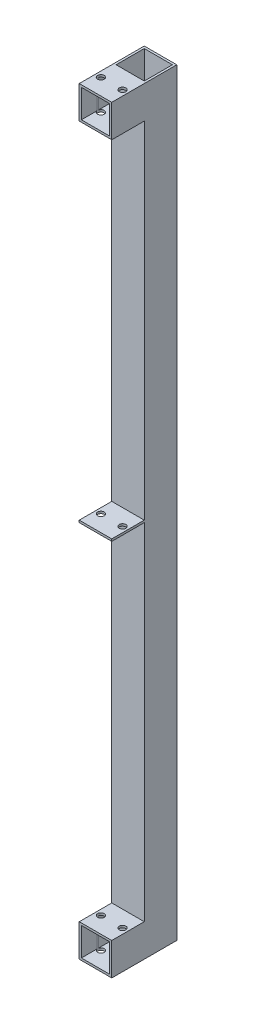
ISO-10303-21;
HEADER;
FILE_DESCRIPTION(('STEP AP214'),'2;1');
FILE_NAME('part.step','',(''),(''),'','','');
FILE_SCHEMA(('AUTOMOTIVE_DESIGN { 1 0 10303 214 1 1 1 1 }'));
ENDSEC;
DATA;
#1=APPLICATION_CONTEXT('core data for automotive mechanical design processes');
#2=APPLICATION_PROTOCOL_DEFINITION('international standard','automotive_design',2000,#1);
#3=PRODUCT_CONTEXT('',#1,'mechanical');
#4=PRODUCT('Part','Part','',(#3));
#5=PRODUCT_RELATED_PRODUCT_CATEGORY('part','',(#4));
#6=PRODUCT_DEFINITION_FORMATION('','',#4);
#7=PRODUCT_DEFINITION_CONTEXT('part definition',#1,'design');
#8=PRODUCT_DEFINITION('design','',#6,#7);
#9=PRODUCT_DEFINITION_SHAPE('','',#8);
#10=(LENGTH_UNIT() NAMED_UNIT(*) SI_UNIT(.MILLI.,.METRE.));
#11=(NAMED_UNIT(*) PLANE_ANGLE_UNIT() SI_UNIT($,.RADIAN.));
#12=(NAMED_UNIT(*) SI_UNIT($,.STERADIAN.) SOLID_ANGLE_UNIT());
#13=UNCERTAINTY_MEASURE_WITH_UNIT(LENGTH_MEASURE(1.E-05),#10,'distance_accuracy_value','');
#14=(GEOMETRIC_REPRESENTATION_CONTEXT(3) GLOBAL_UNCERTAINTY_ASSIGNED_CONTEXT((#13)) GLOBAL_UNIT_ASSIGNED_CONTEXT((#10,
#11,#12)) REPRESENTATION_CONTEXT('',''));
#15=CARTESIAN_POINT('',(0.,0.,0.));
#16=DIRECTION('',(0.,0.,1.));
#17=DIRECTION('',(1.,0.,0.));
#18=AXIS2_PLACEMENT_3D('',#15,#16,#17);
#19=CARTESIAN_POINT('',(13.,348.,30.));
#20=DIRECTION('',(1.,0.,0.));
#21=DIRECTION('',(0.,1.,0.));
#22=AXIS2_PLACEMENT_3D('',#19,#20,#21);
#23=PLANE('',#22);
#24=DIRECTION('',(0.,0.,1.));
#25=VECTOR('',#24,1.);
#26=CARTESIAN_POINT('',(13.,348.,30.));
#27=LINE('',#26,#25);
#28=CARTESIAN_POINT('',(13.,348.,45.55));
#29=VERTEX_POINT('',#28);
#30=CARTESIAN_POINT('',(13.,348.,60.));
#31=VERTEX_POINT('',#30);
#32=EDGE_CURVE('E303',#29,#31,#27,.T.);
#33=ORIENTED_EDGE('',*,*,#32,.F.);
#34=DIRECTION('',(0.,-1.,0.));
#35=VECTOR('',#34,1.);
#36=CARTESIAN_POINT('',(13.,350.,45.55));
#37=LINE('',#36,#35);
#38=CARTESIAN_POINT('',(13.,322.,45.55));
#39=VERTEX_POINT('',#38);
#40=EDGE_CURVE('E540',#29,#39,#37,.T.);
#41=ORIENTED_EDGE('',*,*,#40,.T.);
#42=DIRECTION('',(0.,0.,1.));
#43=VECTOR('',#42,1.);
#44=CARTESIAN_POINT('',(13.,322.,30.));
#45=LINE('',#44,#43);
#46=CARTESIAN_POINT('',(13.,322.,60.));
#47=VERTEX_POINT('',#46);
#48=EDGE_CURVE('E307',#39,#47,#45,.T.);
#49=ORIENTED_EDGE('',*,*,#48,.T.);
#50=DIRECTION('',(0.,1.,0.));
#51=VECTOR('',#50,1.);
#52=CARTESIAN_POINT('',(13.,348.,60.));
#53=LINE('',#52,#51);
#54=EDGE_CURVE('E290',#47,#31,#53,.T.);
#55=ORIENTED_EDGE('',*,*,#54,.T.);
#56=EDGE_LOOP('',(#33,#41,#49,#55));
#57=FACE_BOUND('',#56,.T.);
#58=ADVANCED_FACE('F32',(#57),#23,.F.);
#59=CARTESIAN_POINT('',(13.,-322.,30.));
#60=DIRECTION('',(1.,0.,0.));
#61=DIRECTION('',(0.,1.,0.));
#62=AXIS2_PLACEMENT_3D('',#59,#60,#61);
#63=PLANE('',#62);
#64=DIRECTION('',(0.,0.,1.));
#65=VECTOR('',#64,1.);
#66=CARTESIAN_POINT('',(13.,-322.,30.));
#67=LINE('',#66,#65);
#68=CARTESIAN_POINT('',(12.9999999999999,-322.,45.5500000000005));
#69=VERTEX_POINT('',#68);
#70=CARTESIAN_POINT('',(13.,-322.,60.));
#71=VERTEX_POINT('',#70);
#72=EDGE_CURVE('E252',#69,#71,#67,.T.);
#73=ORIENTED_EDGE('',*,*,#72,.F.);
#74=DIRECTION('',(0.,-1.,0.));
#75=VECTOR('',#74,1.);
#76=CARTESIAN_POINT('',(12.9999999999999,350.,45.5500000000005));
#77=LINE('',#76,#75);
#78=CARTESIAN_POINT('',(13.,-348.,45.55));
#79=VERTEX_POINT('',#78);
#80=EDGE_CURVE('E241',#69,#79,#77,.T.);
#81=ORIENTED_EDGE('',*,*,#80,.T.);
#82=DIRECTION('',(0.,0.,1.));
#83=VECTOR('',#82,1.);
#84=CARTESIAN_POINT('',(13.,-348.,30.));
#85=LINE('',#84,#83);
#86=CARTESIAN_POINT('',(13.,-348.,60.));
#87=VERTEX_POINT('',#86);
#88=EDGE_CURVE('E250',#79,#87,#85,.T.);
#89=ORIENTED_EDGE('',*,*,#88,.T.);
#90=DIRECTION('',(0.,1.,0.));
#91=VECTOR('',#90,1.);
#92=CARTESIAN_POINT('',(13.,-322.,60.));
#93=LINE('',#92,#91);
#94=EDGE_CURVE('E431',#87,#71,#93,.T.);
#95=ORIENTED_EDGE('',*,*,#94,.T.);
#96=EDGE_LOOP('',(#73,#81,#89,#95));
#97=FACE_BOUND('',#96,.T.);
#98=ADVANCED_FACE('F248',(#97),#63,.F.);
#99=CARTESIAN_POINT('',(-13.,348.,30.));
#100=DIRECTION('',(-1.,0.,0.));
#101=DIRECTION('',(0.,-1.,0.));
#102=AXIS2_PLACEMENT_3D('',#99,#100,#101);
#103=PLANE('',#102);
#104=DIRECTION('',(0.,0.,1.));
#105=VECTOR('',#104,1.);
#106=CARTESIAN_POINT('',(-13.,348.,30.));
#107=LINE('',#106,#105);
#108=CARTESIAN_POINT('',(-13.,348.,30.));
#109=VERTEX_POINT('',#108);
#110=CARTESIAN_POINT('',(-13.,348.,44.45));
#111=VERTEX_POINT('',#110);
#112=EDGE_CURVE('E295',#109,#111,#107,.T.);
#113=ORIENTED_EDGE('',*,*,#112,.T.);
#114=DIRECTION('',(0.,-1.,0.));
#115=VECTOR('',#114,1.);
#116=CARTESIAN_POINT('',(-13.,350.,44.45));
#117=LINE('',#116,#115);
#118=CARTESIAN_POINT('',(-13.,322.,44.45));
#119=VERTEX_POINT('',#118);
#120=EDGE_CURVE('E578',#111,#119,#117,.T.);
#121=ORIENTED_EDGE('',*,*,#120,.T.);
#122=DIRECTION('',(0.,0.,1.));
#123=VECTOR('',#122,1.);
#124=CARTESIAN_POINT('',(-13.,322.,30.));
#125=LINE('',#124,#123);
#126=CARTESIAN_POINT('',(-13.,322.,30.));
#127=VERTEX_POINT('',#126);
#128=EDGE_CURVE('E308',#127,#119,#125,.T.);
#129=ORIENTED_EDGE('',*,*,#128,.F.);
#130=DIRECTION('',(0.,-1.,0.));
#131=VECTOR('',#130,1.);
#132=CARTESIAN_POINT('',(-13.,348.,30.));
#133=LINE('',#132,#131);
#134=EDGE_CURVE('E269',#109,#127,#133,.T.);
#135=ORIENTED_EDGE('',*,*,#134,.F.);
#136=EDGE_LOOP('',(#113,#121,#129,#135));
#137=FACE_BOUND('',#136,.T.);
#138=ADVANCED_FACE('F506',(#137),#103,.F.);
#139=CARTESIAN_POINT('',(-13.,-322.,30.));
#140=DIRECTION('',(-1.,0.,0.));
#141=DIRECTION('',(0.,-1.,0.));
#142=AXIS2_PLACEMENT_3D('',#139,#140,#141);
#143=PLANE('',#142);
#144=DIRECTION('',(0.,0.,1.));
#145=VECTOR('',#144,1.);
#146=CARTESIAN_POINT('',(-13.,-322.,30.));
#147=LINE('',#146,#145);
#148=CARTESIAN_POINT('',(-13.,-322.,30.));
#149=VERTEX_POINT('',#148);
#150=CARTESIAN_POINT('',(-13.0000000000001,-322.,44.4500000000005));
#151=VERTEX_POINT('',#150);
#152=EDGE_CURVE('E287',#149,#151,#147,.T.);
#153=ORIENTED_EDGE('',*,*,#152,.T.);
#154=DIRECTION('',(0.,-1.,0.));
#155=VECTOR('',#154,1.);
#156=CARTESIAN_POINT('',(-13.0000000000001,350.,44.4500000000005));
#157=LINE('',#156,#155);
#158=CARTESIAN_POINT('',(-13.,-348.,44.45));
#159=VERTEX_POINT('',#158);
#160=EDGE_CURVE('E567',#151,#159,#157,.T.);
#161=ORIENTED_EDGE('',*,*,#160,.T.);
#162=DIRECTION('',(0.,0.,1.));
#163=VECTOR('',#162,1.);
#164=CARTESIAN_POINT('',(-13.,-348.,30.));
#165=LINE('',#164,#163);
#166=CARTESIAN_POINT('',(-13.,-348.,30.));
#167=VERTEX_POINT('',#166);
#168=EDGE_CURVE('E260',#167,#159,#165,.T.);
#169=ORIENTED_EDGE('',*,*,#168,.F.);
#170=DIRECTION('',(0.,-1.,0.));
#171=VECTOR('',#170,1.);
#172=CARTESIAN_POINT('',(-13.,-322.,30.));
#173=LINE('',#172,#171);
#174=EDGE_CURVE('E435',#149,#167,#173,.T.);
#175=ORIENTED_EDGE('',*,*,#174,.F.);
#176=EDGE_LOOP('',(#153,#161,#169,#175));
#177=FACE_BOUND('',#176,.T.);
#178=ADVANCED_FACE('F500',(#177),#143,.F.);
#179=CARTESIAN_POINT('',(0.,0.,30.));
#180=DIRECTION('',(0.,0.,1.));
#181=DIRECTION('',(1.,0.,0.));
#182=AXIS2_PLACEMENT_3D('',#179,#180,#181);
#183=PLANE('',#182);
#184=DIRECTION('',(0.,1.,0.));
#185=VECTOR('',#184,1.);
#186=CARTESIAN_POINT('',(15.,-350.,30.));
#187=LINE('',#186,#185);
#188=CARTESIAN_POINT('',(15.,-320.,30.));
#189=VERTEX_POINT('',#188);
#190=CARTESIAN_POINT('',(15.,-1.,30.));
#191=VERTEX_POINT('',#190);
#192=EDGE_CURVE('E381',#189,#191,#187,.T.);
#193=ORIENTED_EDGE('',*,*,#192,.T.);
#194=DIRECTION('',(1.,0.,0.));
#195=VECTOR('',#194,1.);
#196=CARTESIAN_POINT('',(15.,-0.999999999999999,30.));
#197=LINE('',#196,#195);
#198=CARTESIAN_POINT('',(-15.,-1.,30.));
#199=VERTEX_POINT('',#198);
#200=EDGE_CURVE('E298',#199,#191,#197,.T.);
#201=ORIENTED_EDGE('',*,*,#200,.F.);
#202=DIRECTION('',(0.,-1.,0.));
#203=VECTOR('',#202,1.);
#204=CARTESIAN_POINT('',(-15.,-350.,30.));
#205=LINE('',#204,#203);
#206=CARTESIAN_POINT('',(-15.,-320.,30.));
#207=VERTEX_POINT('',#206);
#208=EDGE_CURVE('E380',#199,#207,#205,.T.);
#209=ORIENTED_EDGE('',*,*,#208,.T.);
#210=DIRECTION('',(-1.,0.,0.));
#211=VECTOR('',#210,1.);
#212=CARTESIAN_POINT('',(-15.,-320.,30.));
#213=LINE('',#212,#211);
#214=EDGE_CURVE('E337',#189,#207,#213,.T.);
#215=ORIENTED_EDGE('',*,*,#214,.F.);
#216=EDGE_LOOP('',(#193,#201,#209,#215));
#217=FACE_BOUND('',#216,.T.);
#218=ADVANCED_FACE('F498',(#217),#183,.T.);
#219=CARTESIAN_POINT('',(-15.,320.,30.));
#220=VERTEX_POINT('',#219);
#221=CARTESIAN_POINT('',(-15.,1.,30.));
#222=VERTEX_POINT('',#221);
#223=EDGE_CURVE('E377',#220,#222,#205,.T.);
#224=ORIENTED_EDGE('',*,*,#223,.T.);
#225=DIRECTION('',(-1.,0.,0.));
#226=VECTOR('',#225,1.);
#227=CARTESIAN_POINT('',(15.,1.,30.));
#228=LINE('',#227,#226);
#229=CARTESIAN_POINT('',(15.,1.,30.));
#230=VERTEX_POINT('',#229);
#231=EDGE_CURVE('E315',#230,#222,#228,.T.);
#232=ORIENTED_EDGE('',*,*,#231,.F.);
#233=CARTESIAN_POINT('',(15.,320.,30.));
#234=VERTEX_POINT('',#233);
#235=EDGE_CURVE('E379',#230,#234,#187,.T.);
#236=ORIENTED_EDGE('',*,*,#235,.T.);
#237=DIRECTION('',(1.,0.,0.));
#238=VECTOR('',#237,1.);
#239=CARTESIAN_POINT('',(-15.,320.,30.));
#240=LINE('',#239,#238);
#241=EDGE_CURVE('E356',#220,#234,#240,.T.);
#242=ORIENTED_EDGE('',*,*,#241,.F.);
#243=EDGE_LOOP('',(#224,#232,#236,#242));
#244=FACE_BOUND('',#243,.T.);
#245=ADVANCED_FACE('F487',(#244),#183,.T.);
#246=CARTESIAN_POINT('',(-15.,-350.,30.));
#247=DIRECTION('',(1.,0.,0.));
#248=DIRECTION('',(0.,0.,-1.));
#249=AXIS2_PLACEMENT_3D('',#246,#247,#248);
#250=PLANE('',#249);
#251=DIRECTION('',(0.,-1.,0.));
#252=VECTOR('',#251,1.);
#253=CARTESIAN_POINT('',(-15.,-350.,0.));
#254=LINE('',#253,#252);
#255=CARTESIAN_POINT('',(-15.,350.,0.));
#256=VERTEX_POINT('',#255);
#257=CARTESIAN_POINT('',(-15.,-350.,0.));
#258=VERTEX_POINT('',#257);
#259=EDGE_CURVE('E376',#256,#258,#254,.T.);
#260=ORIENTED_EDGE('',*,*,#259,.T.);
#261=DIRECTION('',(0.,0.,-1.));
#262=VECTOR('',#261,1.);
#263=CARTESIAN_POINT('',(-15.,-350.,30.));
#264=LINE('',#263,#262);
#265=CARTESIAN_POINT('',(-15.,-350.,60.));
#266=VERTEX_POINT('',#265);
#267=EDGE_CURVE('E400',#266,#258,#264,.T.);
#268=ORIENTED_EDGE('',*,*,#267,.F.);
#269=DIRECTION('',(0.,-1.,0.));
#270=VECTOR('',#269,1.);
#271=CARTESIAN_POINT('',(-15.,-350.,60.));
#272=LINE('',#271,#270);
#273=CARTESIAN_POINT('',(-15.,-320.,60.));
#274=VERTEX_POINT('',#273);
#275=EDGE_CURVE('E345',#274,#266,#272,.T.);
#276=ORIENTED_EDGE('',*,*,#275,.F.);
#277=DIRECTION('',(0.,0.,-1.));
#278=VECTOR('',#277,1.);
#279=CARTESIAN_POINT('',(-15.,-320.,60.));
#280=LINE('',#279,#278);
#281=EDGE_CURVE('E348',#274,#207,#280,.T.);
#282=ORIENTED_EDGE('',*,*,#281,.T.);
#283=ORIENTED_EDGE('',*,*,#208,.F.);
#284=DIRECTION('',(0.,0.,-1.));
#285=VECTOR('',#284,1.);
#286=CARTESIAN_POINT('',(-15.,-0.999999999999999,60.));
#287=LINE('',#286,#285);
#288=CARTESIAN_POINT('',(-15.,-0.999999999999999,60.));
#289=VERTEX_POINT('',#288);
#290=EDGE_CURVE('E334',#289,#199,#287,.T.);
#291=ORIENTED_EDGE('',*,*,#290,.F.);
#292=DIRECTION('',(0.,-1.,0.));
#293=VECTOR('',#292,1.);
#294=CARTESIAN_POINT('',(-15.,1.,60.));
#295=LINE('',#294,#293);
#296=CARTESIAN_POINT('',(-15.,1.,60.));
#297=VERTEX_POINT('',#296);
#298=EDGE_CURVE('E311',#297,#289,#295,.T.);
#299=ORIENTED_EDGE('',*,*,#298,.F.);
#300=DIRECTION('',(0.,0.,-1.));
#301=VECTOR('',#300,1.);
#302=CARTESIAN_POINT('',(-15.,1.,60.));
#303=LINE('',#302,#301);
#304=EDGE_CURVE('E321',#297,#222,#303,.T.);
#305=ORIENTED_EDGE('',*,*,#304,.T.);
#306=ORIENTED_EDGE('',*,*,#223,.F.);
#307=DIRECTION('',(0.,0.,-1.));
#308=VECTOR('',#307,1.);
#309=CARTESIAN_POINT('',(-15.,320.,60.));
#310=LINE('',#309,#308);
#311=CARTESIAN_POINT('',(-15.,320.,60.));
#312=VERTEX_POINT('',#311);
#313=EDGE_CURVE('E373',#312,#220,#310,.T.);
#314=ORIENTED_EDGE('',*,*,#313,.F.);
#315=DIRECTION('',(0.,-1.,0.));
#316=VECTOR('',#315,1.);
#317=CARTESIAN_POINT('',(-15.,350.,60.));
#318=LINE('',#317,#316);
#319=CARTESIAN_POINT('',(-15.,350.,60.));
#320=VERTEX_POINT('',#319);
#321=EDGE_CURVE('E357',#320,#312,#318,.T.);
#322=ORIENTED_EDGE('',*,*,#321,.F.);
#323=DIRECTION('',(0.,0.,-1.));
#324=VECTOR('',#323,1.);
#325=CARTESIAN_POINT('',(-15.,350.,30.));
#326=LINE('',#325,#324);
#327=EDGE_CURVE('E383',#320,#256,#326,.T.);
#328=ORIENTED_EDGE('',*,*,#327,.T.);
#329=EDGE_LOOP('',(#260,#268,#276,#282,#283,#291,#299,#305,#306,#314,#322,#328));
#330=FACE_BOUND('',#329,.T.);
#331=ADVANCED_FACE('F34',(#330),#250,.F.);
#332=CARTESIAN_POINT('',(15.,-350.,30.));
#333=DIRECTION('',(0.,1.,0.));
#334=DIRECTION('',(0.,0.,1.));
#335=AXIS2_PLACEMENT_3D('',#332,#333,#334);
#336=PLANE('',#335);
#337=CARTESIAN_POINT('',(10.,-350.,45.));
#338=DIRECTION('',(0.,-1.,0.));
#339=DIRECTION('',(0.,0.,-1.));
#340=AXIS2_PLACEMENT_3D('',#337,#338,#339);
#341=CIRCLE('',#340,3.05);
#342=CARTESIAN_POINT('',(10.,-350.,41.95));
#343=VERTEX_POINT('',#342);
#344=EDGE_CURVE('E634',#343,#343,#341,.T.);
#345=ORIENTED_EDGE('',*,*,#344,.F.);
#346=EDGE_LOOP('',(#345));
#347=FACE_BOUND('',#346,.T.);
#348=CARTESIAN_POINT('',(-10.,-350.,45.));
#349=DIRECTION('',(0.,-1.,0.));
#350=DIRECTION('',(0.,0.,-1.));
#351=AXIS2_PLACEMENT_3D('',#348,#349,#350);
#352=CIRCLE('',#351,3.05);
#353=CARTESIAN_POINT('',(-10.,-350.,41.95));
#354=VERTEX_POINT('',#353);
#355=EDGE_CURVE('E560',#354,#354,#352,.T.);
#356=ORIENTED_EDGE('',*,*,#355,.F.);
#357=EDGE_LOOP('',(#356));
#358=FACE_BOUND('',#357,.T.);
#359=DIRECTION('',(1.,0.,0.));
#360=VECTOR('',#359,1.);
#361=CARTESIAN_POINT('',(13.,-350.,2.));
#362=LINE('',#361,#360);
#363=CARTESIAN_POINT('',(-13.,-350.,1.99999999999999));
#364=VERTEX_POINT('',#363);
#365=CARTESIAN_POINT('',(13.,-350.,2.));
#366=VERTEX_POINT('',#365);
#367=EDGE_CURVE('E612',#364,#366,#362,.T.);
#368=ORIENTED_EDGE('',*,*,#367,.F.);
#369=DIRECTION('',(0.,0.,-1.));
#370=VECTOR('',#369,1.);
#371=CARTESIAN_POINT('',(-13.,-350.,28.));
#372=LINE('',#371,#370);
#373=CARTESIAN_POINT('',(-13.,-350.,28.));
#374=VERTEX_POINT('',#373);
#375=EDGE_CURVE('E596',#374,#364,#372,.T.);
#376=ORIENTED_EDGE('',*,*,#375,.F.);
#377=DIRECTION('',(-1.,0.,0.));
#378=VECTOR('',#377,1.);
#379=CARTESIAN_POINT('',(13.,-350.,28.));
#380=LINE('',#379,#378);
#381=CARTESIAN_POINT('',(13.,-350.,28.));
#382=VERTEX_POINT('',#381);
#383=EDGE_CURVE('E601',#382,#374,#380,.T.);
#384=ORIENTED_EDGE('',*,*,#383,.F.);
#385=DIRECTION('',(0.,0.,1.));
#386=VECTOR('',#385,1.);
#387=CARTESIAN_POINT('',(13.,-350.,28.));
#388=LINE('',#387,#386);
#389=EDGE_CURVE('E615',#366,#382,#388,.T.);
#390=ORIENTED_EDGE('',*,*,#389,.F.);
#391=EDGE_LOOP('',(#368,#376,#384,#390));
#392=FACE_BOUND('',#391,.T.);
#393=DIRECTION('',(1.,0.,0.));
#394=VECTOR('',#393,1.);
#395=CARTESIAN_POINT('',(15.,-350.,0.));
#396=LINE('',#395,#394);
#397=CARTESIAN_POINT('',(15.,-350.,0.));
#398=VERTEX_POINT('',#397);
#399=EDGE_CURVE('E386',#258,#398,#396,.T.);
#400=ORIENTED_EDGE('',*,*,#399,.T.);
#401=DIRECTION('',(0.,0.,-1.));
#402=VECTOR('',#401,1.);
#403=CARTESIAN_POINT('',(15.,-350.,30.));
#404=LINE('',#403,#402);
#405=CARTESIAN_POINT('',(15.,-350.,60.));
#406=VERTEX_POINT('',#405);
#407=EDGE_CURVE('E397',#406,#398,#404,.T.);
#408=ORIENTED_EDGE('',*,*,#407,.F.);
#409=DIRECTION('',(1.,0.,0.));
#410=VECTOR('',#409,1.);
#411=CARTESIAN_POINT('',(-15.,-350.,60.));
#412=LINE('',#411,#410);
#413=EDGE_CURVE('E338',#266,#406,#412,.T.);
#414=ORIENTED_EDGE('',*,*,#413,.F.);
#415=ORIENTED_EDGE('',*,*,#267,.T.);
#416=EDGE_LOOP('',(#400,#408,#414,#415));
#417=FACE_BOUND('',#416,.T.);
#418=ADVANCED_FACE('F456',(#347,#358,#392,#417),#336,.F.);
#419=CARTESIAN_POINT('',(15.,-350.,30.));
#420=DIRECTION('',(-1.,0.,0.));
#421=DIRECTION('',(0.,0.,1.));
#422=AXIS2_PLACEMENT_3D('',#419,#420,#421);
#423=PLANE('',#422);
#424=DIRECTION('',(0.,1.,0.));
#425=VECTOR('',#424,1.);
#426=CARTESIAN_POINT('',(15.,-350.,0.));
#427=LINE('',#426,#425);
#428=CARTESIAN_POINT('',(15.,350.,0.));
#429=VERTEX_POINT('',#428);
#430=EDGE_CURVE('E388',#398,#429,#427,.T.);
#431=ORIENTED_EDGE('',*,*,#430,.T.);
#432=DIRECTION('',(0.,0.,-1.));
#433=VECTOR('',#432,1.);
#434=CARTESIAN_POINT('',(15.,350.,30.));
#435=LINE('',#434,#433);
#436=CARTESIAN_POINT('',(15.,350.,60.));
#437=VERTEX_POINT('',#436);
#438=EDGE_CURVE('E394',#437,#429,#435,.T.);
#439=ORIENTED_EDGE('',*,*,#438,.F.);
#440=DIRECTION('',(0.,1.,0.));
#441=VECTOR('',#440,1.);
#442=CARTESIAN_POINT('',(15.,350.,60.));
#443=LINE('',#442,#441);
#444=CARTESIAN_POINT('',(15.,320.,60.));
#445=VERTEX_POINT('',#444);
#446=EDGE_CURVE('E362',#445,#437,#443,.T.);
#447=ORIENTED_EDGE('',*,*,#446,.F.);
#448=DIRECTION('',(0.,0.,-1.));
#449=VECTOR('',#448,1.);
#450=CARTESIAN_POINT('',(15.,320.,60.));
#451=LINE('',#450,#449);
#452=EDGE_CURVE('E368',#445,#234,#451,.T.);
#453=ORIENTED_EDGE('',*,*,#452,.T.);
#454=ORIENTED_EDGE('',*,*,#235,.F.);
#455=DIRECTION('',(0.,0.,-1.));
#456=VECTOR('',#455,1.);
#457=CARTESIAN_POINT('',(15.,1.,60.));
#458=LINE('',#457,#456);
#459=CARTESIAN_POINT('',(15.,1.,60.));
#460=VERTEX_POINT('',#459);
#461=EDGE_CURVE('E328',#460,#230,#458,.T.);
#462=ORIENTED_EDGE('',*,*,#461,.F.);
#463=DIRECTION('',(0.,1.,0.));
#464=VECTOR('',#463,1.);
#465=CARTESIAN_POINT('',(15.,1.,60.));
#466=LINE('',#465,#464);
#467=CARTESIAN_POINT('',(15.,-0.999999999999999,60.));
#468=VERTEX_POINT('',#467);
#469=EDGE_CURVE('E317',#468,#460,#466,.T.);
#470=ORIENTED_EDGE('',*,*,#469,.F.);
#471=DIRECTION('',(0.,0.,-1.));
#472=VECTOR('',#471,1.);
#473=CARTESIAN_POINT('',(15.,-0.999999999999999,60.));
#474=LINE('',#473,#472);
#475=EDGE_CURVE('E331',#468,#191,#474,.T.);
#476=ORIENTED_EDGE('',*,*,#475,.T.);
#477=ORIENTED_EDGE('',*,*,#192,.F.);
#478=DIRECTION('',(0.,0.,-1.));
#479=VECTOR('',#478,1.);
#480=CARTESIAN_POINT('',(15.,-320.,60.));
#481=LINE('',#480,#479);
#482=CARTESIAN_POINT('',(15.,-320.,60.));
#483=VERTEX_POINT('',#482);
#484=EDGE_CURVE('E353',#483,#189,#481,.T.);
#485=ORIENTED_EDGE('',*,*,#484,.F.);
#486=DIRECTION('',(0.,1.,0.));
#487=VECTOR('',#486,1.);
#488=CARTESIAN_POINT('',(15.,-350.,60.));
#489=LINE('',#488,#487);
#490=EDGE_CURVE('E341',#406,#483,#489,.T.);
#491=ORIENTED_EDGE('',*,*,#490,.F.);
#492=ORIENTED_EDGE('',*,*,#407,.T.);
#493=EDGE_LOOP('',(#431,#439,#447,#453,#454,#462,#470,#476,#477,#485,#491,#492));
#494=FACE_BOUND('',#493,.T.);
#495=ADVANCED_FACE('F459',(#494),#423,.F.);
#496=CARTESIAN_POINT('',(15.,350.,30.));
#497=DIRECTION('',(0.,-1.,0.));
#498=DIRECTION('',(0.,0.,-1.));
#499=AXIS2_PLACEMENT_3D('',#496,#497,#498);
#500=PLANE('',#499);
#501=CARTESIAN_POINT('',(10.,350.,45.));
#502=DIRECTION('',(0.,-1.,0.));
#503=DIRECTION('',(0.,0.,-1.));
#504=AXIS2_PLACEMENT_3D('',#501,#502,#503);
#505=CIRCLE('',#504,3.05);
#506=CARTESIAN_POINT('',(10.,350.,41.95));
#507=VERTEX_POINT('',#506);
#508=EDGE_CURVE('E631',#507,#507,#505,.T.);
#509=ORIENTED_EDGE('',*,*,#508,.T.);
#510=EDGE_LOOP('',(#509));
#511=FACE_BOUND('',#510,.T.);
#512=CARTESIAN_POINT('',(-10.,350.,45.));
#513=DIRECTION('',(0.,-1.,0.));
#514=DIRECTION('',(0.,0.,-1.));
#515=AXIS2_PLACEMENT_3D('',#512,#513,#514);
#516=CIRCLE('',#515,3.05);
#517=CARTESIAN_POINT('',(-10.,350.,41.95));
#518=VERTEX_POINT('',#517);
#519=EDGE_CURVE('E561',#518,#518,#516,.T.);
#520=ORIENTED_EDGE('',*,*,#519,.T.);
#521=EDGE_LOOP('',(#520));
#522=FACE_BOUND('',#521,.T.);
#523=DIRECTION('',(-1.,0.,0.));
#524=VECTOR('',#523,1.);
#525=CARTESIAN_POINT('',(13.,350.,28.));
#526=LINE('',#525,#524);
#527=CARTESIAN_POINT('',(13.,350.,28.));
#528=VERTEX_POINT('',#527);
#529=CARTESIAN_POINT('',(-13.,350.,28.));
#530=VERTEX_POINT('',#529);
#531=EDGE_CURVE('E607',#528,#530,#526,.T.);
#532=ORIENTED_EDGE('',*,*,#531,.T.);
#533=DIRECTION('',(0.,0.,-1.));
#534=VECTOR('',#533,1.);
#535=CARTESIAN_POINT('',(-13.,350.,28.));
#536=LINE('',#535,#534);
#537=CARTESIAN_POINT('',(-13.,350.,1.99999999999999));
#538=VERTEX_POINT('',#537);
#539=EDGE_CURVE('E597',#530,#538,#536,.T.);
#540=ORIENTED_EDGE('',*,*,#539,.T.);
#541=DIRECTION('',(1.,0.,0.));
#542=VECTOR('',#541,1.);
#543=CARTESIAN_POINT('',(13.,350.,2.));
#544=LINE('',#543,#542);
#545=CARTESIAN_POINT('',(13.,350.,2.));
#546=VERTEX_POINT('',#545);
#547=EDGE_CURVE('E600',#538,#546,#544,.T.);
#548=ORIENTED_EDGE('',*,*,#547,.T.);
#549=DIRECTION('',(0.,0.,1.));
#550=VECTOR('',#549,1.);
#551=CARTESIAN_POINT('',(13.,350.,28.));
#552=LINE('',#551,#550);
#553=EDGE_CURVE('E604',#546,#528,#552,.T.);
#554=ORIENTED_EDGE('',*,*,#553,.T.);
#555=EDGE_LOOP('',(#532,#540,#548,#554));
#556=FACE_BOUND('',#555,.T.);
#557=DIRECTION('',(-1.,0.,0.));
#558=VECTOR('',#557,1.);
#559=CARTESIAN_POINT('',(15.,350.,0.));
#560=LINE('',#559,#558);
#561=EDGE_CURVE('E390',#429,#256,#560,.T.);
#562=ORIENTED_EDGE('',*,*,#561,.T.);
#563=ORIENTED_EDGE('',*,*,#327,.F.);
#564=DIRECTION('',(-1.,0.,0.));
#565=VECTOR('',#564,1.);
#566=CARTESIAN_POINT('',(-15.,350.,60.));
#567=LINE('',#566,#565);
#568=EDGE_CURVE('E365',#437,#320,#567,.T.);
#569=ORIENTED_EDGE('',*,*,#568,.F.);
#570=ORIENTED_EDGE('',*,*,#438,.T.);
#571=EDGE_LOOP('',(#562,#563,#569,#570));
#572=FACE_BOUND('',#571,.T.);
#573=ADVANCED_FACE('F474',(#511,#522,#556,#572),#500,.F.);
#574=CARTESIAN_POINT('',(0.,0.,0.));
#575=DIRECTION('',(0.,0.,1.));
#576=DIRECTION('',(1.,0.,0.));
#577=AXIS2_PLACEMENT_3D('',#574,#575,#576);
#578=PLANE('',#577);
#579=CARTESIAN_POINT('',(0.,0.,0.));
#580=DIRECTION('',(0.,0.,-1.));
#581=DIRECTION('',(-1.,0.,0.));
#582=AXIS2_PLACEMENT_3D('',#579,#580,#581);
#583=CIRCLE('',#582,7.05);
#584=CARTESIAN_POINT('',(-7.05,0.,0.));
#585=VERTEX_POINT('',#584);
#586=EDGE_CURVE('E639',#585,#585,#583,.T.);
#587=ORIENTED_EDGE('',*,*,#586,.F.);
#588=EDGE_LOOP('',(#587));
#589=FACE_BOUND('',#588,.T.);
#590=ORIENTED_EDGE('',*,*,#259,.F.);
#591=ORIENTED_EDGE('',*,*,#561,.F.);
#592=ORIENTED_EDGE('',*,*,#430,.F.);
#593=ORIENTED_EDGE('',*,*,#399,.F.);
#594=EDGE_LOOP('',(#590,#591,#592,#593));
#595=FACE_BOUND('',#594,.T.);
#596=ADVANCED_FACE('F470',(#589,#595),#578,.F.);
#597=CARTESIAN_POINT('',(-15.,320.,60.));
#598=DIRECTION('',(0.,1.,0.));
#599=DIRECTION('',(0.,0.,1.));
#600=AXIS2_PLACEMENT_3D('',#597,#598,#599);
#601=PLANE('',#600);
#602=CARTESIAN_POINT('',(10.,320.,45.));
#603=DIRECTION('',(0.,1.,0.));
#604=DIRECTION('',(0.,0.,1.));
#605=AXIS2_PLACEMENT_3D('',#602,#603,#604);
#606=CIRCLE('',#605,3.05);
#607=CARTESIAN_POINT('',(10.,320.,48.05));
#608=VERTEX_POINT('',#607);
#609=EDGE_CURVE('E557',#608,#608,#606,.T.);
#610=ORIENTED_EDGE('',*,*,#609,.T.);
#611=EDGE_LOOP('',(#610));
#612=FACE_BOUND('',#611,.T.);
#613=CARTESIAN_POINT('',(-10.,320.,45.));
#614=DIRECTION('',(0.,1.,0.));
#615=DIRECTION('',(0.,0.,1.));
#616=AXIS2_PLACEMENT_3D('',#613,#614,#615);
#617=CIRCLE('',#616,3.05);
#618=CARTESIAN_POINT('',(-10.,320.,48.05));
#619=VERTEX_POINT('',#618);
#620=EDGE_CURVE('E593',#619,#619,#617,.T.);
#621=ORIENTED_EDGE('',*,*,#620,.T.);
#622=EDGE_LOOP('',(#621));
#623=FACE_BOUND('',#622,.T.);
#624=ORIENTED_EDGE('',*,*,#241,.T.);
#625=ORIENTED_EDGE('',*,*,#452,.F.);
#626=DIRECTION('',(1.,0.,0.));
#627=VECTOR('',#626,1.);
#628=CARTESIAN_POINT('',(-15.,320.,60.));
#629=LINE('',#628,#627);
#630=EDGE_CURVE('E360',#312,#445,#629,.T.);
#631=ORIENTED_EDGE('',*,*,#630,.F.);
#632=ORIENTED_EDGE('',*,*,#313,.T.);
#633=EDGE_LOOP('',(#624,#625,#631,#632));
#634=FACE_BOUND('',#633,.T.);
#635=ADVANCED_FACE('F480',(#612,#623,#634),#601,.F.);
#636=CARTESIAN_POINT('',(0.,0.,60.));
#637=DIRECTION('',(0.,0.,1.));
#638=DIRECTION('',(1.,0.,0.));
#639=AXIS2_PLACEMENT_3D('',#636,#637,#638);
#640=PLANE('',#639);
#641=DIRECTION('',(0.,-1.,0.));
#642=VECTOR('',#641,1.);
#643=CARTESIAN_POINT('',(-13.,348.,60.));
#644=LINE('',#643,#642);
#645=CARTESIAN_POINT('',(-13.,348.,60.));
#646=VERTEX_POINT('',#645);
#647=CARTESIAN_POINT('',(-13.,322.,60.));
#648=VERTEX_POINT('',#647);
#649=EDGE_CURVE('E283',#646,#648,#644,.T.);
#650=ORIENTED_EDGE('',*,*,#649,.F.);
#651=DIRECTION('',(-1.,0.,0.));
#652=VECTOR('',#651,1.);
#653=CARTESIAN_POINT('',(13.,348.,60.));
#654=LINE('',#653,#652);
#655=EDGE_CURVE('E273',#31,#646,#654,.T.);
#656=ORIENTED_EDGE('',*,*,#655,.F.);
#657=ORIENTED_EDGE('',*,*,#54,.F.);
#658=DIRECTION('',(1.,0.,0.));
#659=VECTOR('',#658,1.);
#660=CARTESIAN_POINT('',(13.,322.,60.));
#661=LINE('',#660,#659);
#662=EDGE_CURVE('E286',#648,#47,#661,.T.);
#663=ORIENTED_EDGE('',*,*,#662,.F.);
#664=EDGE_LOOP('',(#650,#656,#657,#663));
#665=FACE_BOUND('',#664,.T.);
#666=ORIENTED_EDGE('',*,*,#321,.T.);
#667=ORIENTED_EDGE('',*,*,#630,.T.);
#668=ORIENTED_EDGE('',*,*,#446,.T.);
#669=ORIENTED_EDGE('',*,*,#568,.T.);
#670=EDGE_LOOP('',(#666,#667,#668,#669));
#671=FACE_BOUND('',#670,.T.);
#672=ADVANCED_FACE('F476',(#665,#671),#640,.T.);
#673=CARTESIAN_POINT('',(-15.,-320.,60.));
#674=DIRECTION('',(0.,-1.,0.));
#675=DIRECTION('',(0.,0.,-1.));
#676=AXIS2_PLACEMENT_3D('',#673,#674,#675);
#677=PLANE('',#676);
#678=CARTESIAN_POINT('',(10.,-320.,45.));
#679=DIRECTION('',(0.,-1.,0.));
#680=DIRECTION('',(0.,0.,-1.));
#681=AXIS2_PLACEMENT_3D('',#678,#679,#680);
#682=CIRCLE('',#681,3.05);
#683=CARTESIAN_POINT('',(10.,-320.,41.95));
#684=VERTEX_POINT('',#683);
#685=EDGE_CURVE('E554',#684,#684,#682,.T.);
#686=ORIENTED_EDGE('',*,*,#685,.T.);
#687=EDGE_LOOP('',(#686));
#688=FACE_BOUND('',#687,.T.);
#689=CARTESIAN_POINT('',(-10.,-320.,45.));
#690=DIRECTION('',(0.,-1.,0.));
#691=DIRECTION('',(0.,0.,-1.));
#692=AXIS2_PLACEMENT_3D('',#689,#690,#691);
#693=CIRCLE('',#692,3.05);
#694=CARTESIAN_POINT('',(-10.,-320.,41.95));
#695=VERTEX_POINT('',#694);
#696=EDGE_CURVE('E590',#695,#695,#693,.T.);
#697=ORIENTED_EDGE('',*,*,#696,.T.);
#698=EDGE_LOOP('',(#697));
#699=FACE_BOUND('',#698,.T.);
#700=ORIENTED_EDGE('',*,*,#214,.T.);
#701=ORIENTED_EDGE('',*,*,#281,.F.);
#702=DIRECTION('',(-1.,0.,0.));
#703=VECTOR('',#702,1.);
#704=CARTESIAN_POINT('',(-15.,-320.,60.));
#705=LINE('',#704,#703);
#706=EDGE_CURVE('E343',#483,#274,#705,.T.);
#707=ORIENTED_EDGE('',*,*,#706,.F.);
#708=ORIENTED_EDGE('',*,*,#484,.T.);
#709=EDGE_LOOP('',(#700,#701,#707,#708));
#710=FACE_BOUND('',#709,.T.);
#711=ADVANCED_FACE('F449',(#688,#699,#710),#677,.F.);
#712=CARTESIAN_POINT('',(0.,0.,60.));
#713=DIRECTION('',(0.,0.,1.));
#714=DIRECTION('',(1.,0.,0.));
#715=AXIS2_PLACEMENT_3D('',#712,#713,#714);
#716=PLANE('',#715);
#717=DIRECTION('',(0.,-1.,0.));
#718=VECTOR('',#717,1.);
#719=CARTESIAN_POINT('',(-13.,-322.,60.));
#720=LINE('',#719,#718);
#721=CARTESIAN_POINT('',(-13.,-322.,60.));
#722=VERTEX_POINT('',#721);
#723=CARTESIAN_POINT('',(-13.,-348.,60.));
#724=VERTEX_POINT('',#723);
#725=EDGE_CURVE('E415',#722,#724,#720,.T.);
#726=ORIENTED_EDGE('',*,*,#725,.F.);
#727=DIRECTION('',(-1.,0.,0.));
#728=VECTOR('',#727,1.);
#729=CARTESIAN_POINT('',(13.,-322.,60.));
#730=LINE('',#729,#728);
#731=EDGE_CURVE('E433',#71,#722,#730,.T.);
#732=ORIENTED_EDGE('',*,*,#731,.F.);
#733=ORIENTED_EDGE('',*,*,#94,.F.);
#734=DIRECTION('',(1.,0.,0.));
#735=VECTOR('',#734,1.);
#736=CARTESIAN_POINT('',(13.,-348.,60.));
#737=LINE('',#736,#735);
#738=EDGE_CURVE('E257',#724,#87,#737,.T.);
#739=ORIENTED_EDGE('',*,*,#738,.F.);
#740=EDGE_LOOP('',(#726,#732,#733,#739));
#741=FACE_BOUND('',#740,.T.);
#742=ORIENTED_EDGE('',*,*,#413,.T.);
#743=ORIENTED_EDGE('',*,*,#490,.T.);
#744=ORIENTED_EDGE('',*,*,#706,.T.);
#745=ORIENTED_EDGE('',*,*,#275,.T.);
#746=EDGE_LOOP('',(#742,#743,#744,#745));
#747=FACE_BOUND('',#746,.T.);
#748=ADVANCED_FACE('F445',(#741,#747),#716,.T.);
#749=CARTESIAN_POINT('',(15.,-0.999999999999999,60.));
#750=DIRECTION('',(0.,1.,0.));
#751=DIRECTION('',(0.,0.,1.));
#752=AXIS2_PLACEMENT_3D('',#749,#750,#751);
#753=PLANE('',#752);
#754=CARTESIAN_POINT('',(10.,-1.,45.));
#755=DIRECTION('',(0.,1.,0.));
#756=DIRECTION('',(0.,0.,1.));
#757=AXIS2_PLACEMENT_3D('',#754,#755,#756);
#758=CIRCLE('',#757,3.05);
#759=CARTESIAN_POINT('',(10.,-1.,48.05));
#760=VERTEX_POINT('',#759);
#761=EDGE_CURVE('E551',#760,#760,#758,.T.);
#762=ORIENTED_EDGE('',*,*,#761,.T.);
#763=EDGE_LOOP('',(#762));
#764=FACE_BOUND('',#763,.T.);
#765=CARTESIAN_POINT('',(-10.,-1.,45.));
#766=DIRECTION('',(0.,1.,0.));
#767=DIRECTION('',(0.,0.,1.));
#768=AXIS2_PLACEMENT_3D('',#765,#766,#767);
#769=CIRCLE('',#768,3.05);
#770=CARTESIAN_POINT('',(-10.,-1.,48.05));
#771=VERTEX_POINT('',#770);
#772=EDGE_CURVE('E587',#771,#771,#769,.T.);
#773=ORIENTED_EDGE('',*,*,#772,.T.);
#774=EDGE_LOOP('',(#773));
#775=FACE_BOUND('',#774,.T.);
#776=ORIENTED_EDGE('',*,*,#200,.T.);
#777=ORIENTED_EDGE('',*,*,#475,.F.);
#778=DIRECTION('',(1.,0.,0.));
#779=VECTOR('',#778,1.);
#780=CARTESIAN_POINT('',(15.,-0.999999999999999,60.));
#781=LINE('',#780,#779);
#782=EDGE_CURVE('E314',#289,#468,#781,.T.);
#783=ORIENTED_EDGE('',*,*,#782,.F.);
#784=ORIENTED_EDGE('',*,*,#290,.T.);
#785=EDGE_LOOP('',(#776,#777,#783,#784));
#786=FACE_BOUND('',#785,.T.);
#787=ADVANCED_FACE('F448',(#764,#775,#786),#753,.F.);
#788=CARTESIAN_POINT('',(15.,1.,60.));
#789=DIRECTION('',(0.,-1.,0.));
#790=DIRECTION('',(0.,0.,-1.));
#791=AXIS2_PLACEMENT_3D('',#788,#789,#790);
#792=PLANE('',#791);
#793=CARTESIAN_POINT('',(10.,1.,45.));
#794=DIRECTION('',(0.,-1.,0.));
#795=DIRECTION('',(0.,0.,-1.));
#796=AXIS2_PLACEMENT_3D('',#793,#794,#795);
#797=CIRCLE('',#796,3.05);
#798=CARTESIAN_POINT('',(10.,1.,41.95));
#799=VERTEX_POINT('',#798);
#800=EDGE_CURVE('E548',#799,#799,#797,.T.);
#801=ORIENTED_EDGE('',*,*,#800,.T.);
#802=EDGE_LOOP('',(#801));
#803=FACE_BOUND('',#802,.T.);
#804=CARTESIAN_POINT('',(-10.,1.,45.));
#805=DIRECTION('',(0.,-1.,0.));
#806=DIRECTION('',(0.,0.,-1.));
#807=AXIS2_PLACEMENT_3D('',#804,#805,#806);
#808=CIRCLE('',#807,3.05);
#809=CARTESIAN_POINT('',(-10.,1.,41.95));
#810=VERTEX_POINT('',#809);
#811=EDGE_CURVE('E584',#810,#810,#808,.T.);
#812=ORIENTED_EDGE('',*,*,#811,.T.);
#813=EDGE_LOOP('',(#812));
#814=FACE_BOUND('',#813,.T.);
#815=ORIENTED_EDGE('',*,*,#231,.T.);
#816=ORIENTED_EDGE('',*,*,#304,.F.);
#817=DIRECTION('',(-1.,0.,0.));
#818=VECTOR('',#817,1.);
#819=CARTESIAN_POINT('',(15.,1.,60.));
#820=LINE('',#819,#818);
#821=EDGE_CURVE('E319',#460,#297,#820,.T.);
#822=ORIENTED_EDGE('',*,*,#821,.F.);
#823=ORIENTED_EDGE('',*,*,#461,.T.);
#824=EDGE_LOOP('',(#815,#816,#822,#823));
#825=FACE_BOUND('',#824,.T.);
#826=ADVANCED_FACE('F490',(#803,#814,#825),#792,.F.);
#827=CARTESIAN_POINT('',(0.,0.,60.));
#828=DIRECTION('',(0.,0.,-1.));
#829=DIRECTION('',(-1.,0.,0.));
#830=AXIS2_PLACEMENT_3D('',#827,#828,#829);
#831=PLANE('',#830);
#832=ORIENTED_EDGE('',*,*,#298,.T.);
#833=ORIENTED_EDGE('',*,*,#782,.T.);
#834=ORIENTED_EDGE('',*,*,#469,.T.);
#835=ORIENTED_EDGE('',*,*,#821,.T.);
#836=EDGE_LOOP('',(#832,#833,#834,#835));
#837=FACE_BOUND('',#836,.T.);
#838=ADVANCED_FACE('F493',(#837),#831,.F.);
#839=CARTESIAN_POINT('',(-13.,322.,45.55));
#840=VERTEX_POINT('',#839);
#841=EDGE_CURVE('E282',#840,#648,#125,.T.);
#842=ORIENTED_EDGE('',*,*,#841,.F.);
#843=DIRECTION('',(0.,-1.,0.));
#844=VECTOR('',#843,1.);
#845=CARTESIAN_POINT('',(-13.,350.,45.55));
#846=LINE('',#845,#844);
#847=CARTESIAN_POINT('',(-13.,348.,45.55));
#848=VERTEX_POINT('',#847);
#849=EDGE_CURVE('E575',#840,#848,#846,.F.);
#850=ORIENTED_EDGE('',*,*,#849,.T.);
#851=EDGE_CURVE('E299',#848,#646,#107,.T.);
#852=ORIENTED_EDGE('',*,*,#851,.T.);
#853=ORIENTED_EDGE('',*,*,#649,.T.);
#854=EDGE_LOOP('',(#842,#850,#852,#853));
#855=FACE_BOUND('',#854,.T.);
#856=ADVANCED_FACE('F532',(#855),#103,.F.);
#857=CARTESIAN_POINT('',(13.,348.,30.));
#858=DIRECTION('',(0.,1.,0.));
#859=DIRECTION('',(0.,0.,1.));
#860=AXIS2_PLACEMENT_3D('',#857,#858,#859);
#861=PLANE('',#860);
#862=CARTESIAN_POINT('',(13.,348.,30.));
#863=VERTEX_POINT('',#862);
#864=CARTESIAN_POINT('',(13.,348.,44.45));
#865=VERTEX_POINT('',#864);
#866=EDGE_CURVE('E300',#863,#865,#27,.T.);
#867=ORIENTED_EDGE('',*,*,#866,.T.);
#868=CARTESIAN_POINT('',(10.,348.,45.));
#869=DIRECTION('',(0.,1.,0.));
#870=DIRECTION('',(0.,0.,1.));
#871=AXIS2_PLACEMENT_3D('',#868,#869,#870);
#872=CIRCLE('',#871,3.05);
#873=EDGE_CURVE('E545',#865,#29,#872,.T.);
#874=ORIENTED_EDGE('',*,*,#873,.T.);
#875=ORIENTED_EDGE('',*,*,#32,.T.);
#876=ORIENTED_EDGE('',*,*,#655,.T.);
#877=ORIENTED_EDGE('',*,*,#851,.F.);
#878=CARTESIAN_POINT('',(-10.,348.,45.));
#879=DIRECTION('',(0.,1.,0.));
#880=DIRECTION('',(0.,0.,1.));
#881=AXIS2_PLACEMENT_3D('',#878,#879,#880);
#882=CIRCLE('',#881,3.05);
#883=EDGE_CURVE('E581',#848,#111,#882,.T.);
#884=ORIENTED_EDGE('',*,*,#883,.T.);
#885=ORIENTED_EDGE('',*,*,#112,.F.);
#886=DIRECTION('',(-1.,0.,0.));
#887=VECTOR('',#886,1.);
#888=CARTESIAN_POINT('',(13.,348.,30.));
#889=LINE('',#888,#887);
#890=EDGE_CURVE('E279',#863,#109,#889,.T.);
#891=ORIENTED_EDGE('',*,*,#890,.F.);
#892=EDGE_LOOP('',(#867,#874,#875,#876,#877,#884,#885,#891));
#893=FACE_BOUND('',#892,.T.);
#894=ADVANCED_FACE('F524',(#893),#861,.F.);
#895=CARTESIAN_POINT('',(13.,322.,30.));
#896=VERTEX_POINT('',#895);
#897=CARTESIAN_POINT('',(13.,322.,44.45));
#898=VERTEX_POINT('',#897);
#899=EDGE_CURVE('E304',#896,#898,#45,.T.);
#900=ORIENTED_EDGE('',*,*,#899,.T.);
#901=DIRECTION('',(0.,-1.,0.));
#902=VECTOR('',#901,1.);
#903=CARTESIAN_POINT('',(13.,350.,44.45));
#904=LINE('',#903,#902);
#905=EDGE_CURVE('E48',#898,#865,#904,.F.);
#906=ORIENTED_EDGE('',*,*,#905,.T.);
#907=ORIENTED_EDGE('',*,*,#866,.F.);
#908=DIRECTION('',(0.,1.,0.));
#909=VECTOR('',#908,1.);
#910=CARTESIAN_POINT('',(13.,348.,30.));
#911=LINE('',#910,#909);
#912=EDGE_CURVE('E276',#896,#863,#911,.T.);
#913=ORIENTED_EDGE('',*,*,#912,.F.);
#914=EDGE_LOOP('',(#900,#906,#907,#913));
#915=FACE_BOUND('',#914,.T.);
#916=ADVANCED_FACE('F513',(#915),#23,.F.);
#917=CARTESIAN_POINT('',(13.,322.,30.));
#918=DIRECTION('',(0.,-1.,0.));
#919=DIRECTION('',(0.,0.,-1.));
#920=AXIS2_PLACEMENT_3D('',#917,#918,#919);
#921=PLANE('',#920);
#922=ORIENTED_EDGE('',*,*,#48,.F.);
#923=CARTESIAN_POINT('',(10.,322.,45.));
#924=DIRECTION('',(0.,-1.,0.));
#925=DIRECTION('',(0.,0.,-1.));
#926=AXIS2_PLACEMENT_3D('',#923,#924,#925);
#927=CIRCLE('',#926,3.05);
#928=EDGE_CURVE('E537',#39,#898,#927,.T.);
#929=ORIENTED_EDGE('',*,*,#928,.T.);
#930=ORIENTED_EDGE('',*,*,#899,.F.);
#931=DIRECTION('',(1.,0.,0.));
#932=VECTOR('',#931,1.);
#933=CARTESIAN_POINT('',(13.,322.,30.));
#934=LINE('',#933,#932);
#935=EDGE_CURVE('E272',#127,#896,#934,.T.);
#936=ORIENTED_EDGE('',*,*,#935,.F.);
#937=ORIENTED_EDGE('',*,*,#128,.T.);
#938=CARTESIAN_POINT('',(-10.,322.,45.));
#939=DIRECTION('',(0.,-1.,0.));
#940=DIRECTION('',(0.,0.,-1.));
#941=AXIS2_PLACEMENT_3D('',#938,#939,#940);
#942=CIRCLE('',#941,3.05);
#943=EDGE_CURVE('E572',#119,#840,#942,.T.);
#944=ORIENTED_EDGE('',*,*,#943,.T.);
#945=ORIENTED_EDGE('',*,*,#841,.T.);
#946=ORIENTED_EDGE('',*,*,#662,.T.);
#947=EDGE_LOOP('',(#922,#929,#930,#936,#937,#944,#945,#946));
#948=FACE_BOUND('',#947,.T.);
#949=ADVANCED_FACE('F523',(#948),#921,.F.);
#950=CARTESIAN_POINT('',(0.,0.,30.));
#951=DIRECTION('',(0.,0.,-1.));
#952=DIRECTION('',(-1.,0.,0.));
#953=AXIS2_PLACEMENT_3D('',#950,#951,#952);
#954=PLANE('',#953);
#955=ORIENTED_EDGE('',*,*,#134,.T.);
#956=ORIENTED_EDGE('',*,*,#935,.T.);
#957=ORIENTED_EDGE('',*,*,#912,.T.);
#958=ORIENTED_EDGE('',*,*,#890,.T.);
#959=EDGE_LOOP('',(#955,#956,#957,#958));
#960=FACE_BOUND('',#959,.T.);
#961=ADVANCED_FACE('F530',(#960),#954,.F.);
#962=CARTESIAN_POINT('',(-13.,-348.,45.55));
#963=VERTEX_POINT('',#962);
#964=EDGE_CURVE('E263',#963,#724,#165,.T.);
#965=ORIENTED_EDGE('',*,*,#964,.F.);
#966=DIRECTION('',(0.,-1.,0.));
#967=VECTOR('',#966,1.);
#968=CARTESIAN_POINT('',(-13.0000000000001,350.,45.5499999999995));
#969=LINE('',#968,#967);
#970=CARTESIAN_POINT('',(-13.0000000000001,-322.,45.5499999999995));
#971=VERTEX_POINT('',#970);
#972=EDGE_CURVE('E412',#963,#971,#969,.F.);
#973=ORIENTED_EDGE('',*,*,#972,.T.);
#974=EDGE_CURVE('E437',#971,#722,#147,.T.);
#975=ORIENTED_EDGE('',*,*,#974,.T.);
#976=ORIENTED_EDGE('',*,*,#725,.T.);
#977=EDGE_LOOP('',(#965,#973,#975,#976));
#978=FACE_BOUND('',#977,.T.);
#979=ADVANCED_FACE('F411',(#978),#143,.F.);
#980=CARTESIAN_POINT('',(13.,-322.,30.));
#981=DIRECTION('',(0.,1.,0.));
#982=DIRECTION('',(0.,0.,1.));
#983=AXIS2_PLACEMENT_3D('',#980,#981,#982);
#984=PLANE('',#983);
#985=CARTESIAN_POINT('',(13.,-322.,30.));
#986=VERTEX_POINT('',#985);
#987=CARTESIAN_POINT('',(12.9999999999999,-322.,44.4499999999995));
#988=VERTEX_POINT('',#987);
#989=EDGE_CURVE('E266',#986,#988,#67,.T.);
#990=ORIENTED_EDGE('',*,*,#989,.T.);
#991=CARTESIAN_POINT('',(10.,-322.,45.));
#992=DIRECTION('',(0.,1.,0.));
#993=DIRECTION('',(0.,0.,1.));
#994=AXIS2_PLACEMENT_3D('',#991,#992,#993);
#995=CIRCLE('',#994,3.05);
#996=EDGE_CURVE('E253',#988,#69,#995,.T.);
#997=ORIENTED_EDGE('',*,*,#996,.T.);
#998=ORIENTED_EDGE('',*,*,#72,.T.);
#999=ORIENTED_EDGE('',*,*,#731,.T.);
#1000=ORIENTED_EDGE('',*,*,#974,.F.);
#1001=CARTESIAN_POINT('',(-10.,-322.,45.));
#1002=DIRECTION('',(0.,1.,0.));
#1003=DIRECTION('',(0.,0.,1.));
#1004=AXIS2_PLACEMENT_3D('',#1001,#1002,#1003);
#1005=CIRCLE('',#1004,3.05);
#1006=EDGE_CURVE('E569',#971,#151,#1005,.T.);
#1007=ORIENTED_EDGE('',*,*,#1006,.T.);
#1008=ORIENTED_EDGE('',*,*,#152,.F.);
#1009=DIRECTION('',(-1.,0.,0.));
#1010=VECTOR('',#1009,1.);
#1011=CARTESIAN_POINT('',(13.,-322.,30.));
#1012=LINE('',#1011,#1010);
#1013=EDGE_CURVE('E416',#986,#149,#1012,.T.);
#1014=ORIENTED_EDGE('',*,*,#1013,.F.);
#1015=EDGE_LOOP('',(#990,#997,#998,#999,#1000,#1007,#1008,#1014));
#1016=FACE_BOUND('',#1015,.T.);
#1017=ADVANCED_FACE('F442',(#1016),#984,.F.);
#1018=CARTESIAN_POINT('',(13.,-348.,30.));
#1019=VERTEX_POINT('',#1018);
#1020=CARTESIAN_POINT('',(13.,-348.,44.45));
#1021=VERTEX_POINT('',#1020);
#1022=EDGE_CURVE('E259',#1019,#1021,#85,.T.);
#1023=ORIENTED_EDGE('',*,*,#1022,.T.);
#1024=DIRECTION('',(0.,-1.,0.));
#1025=VECTOR('',#1024,1.);
#1026=CARTESIAN_POINT('',(12.9999999999999,350.,44.4499999999995));
#1027=LINE('',#1026,#1025);
#1028=EDGE_CURVE('E56',#1021,#988,#1027,.F.);
#1029=ORIENTED_EDGE('',*,*,#1028,.T.);
#1030=ORIENTED_EDGE('',*,*,#989,.F.);
#1031=DIRECTION('',(0.,1.,0.));
#1032=VECTOR('',#1031,1.);
#1033=CARTESIAN_POINT('',(13.,-322.,30.));
#1034=LINE('',#1033,#1032);
#1035=EDGE_CURVE('E418',#1019,#986,#1034,.T.);
#1036=ORIENTED_EDGE('',*,*,#1035,.F.);
#1037=EDGE_LOOP('',(#1023,#1029,#1030,#1036));
#1038=FACE_BOUND('',#1037,.T.);
#1039=ADVANCED_FACE('F518',(#1038),#63,.F.);
#1040=CARTESIAN_POINT('',(13.,-348.,30.));
#1041=DIRECTION('',(0.,-1.,0.));
#1042=DIRECTION('',(0.,0.,-1.));
#1043=AXIS2_PLACEMENT_3D('',#1040,#1041,#1042);
#1044=PLANE('',#1043);
#1045=ORIENTED_EDGE('',*,*,#88,.F.);
#1046=CARTESIAN_POINT('',(10.,-348.,45.));
#1047=DIRECTION('',(0.,-1.,0.));
#1048=DIRECTION('',(0.,0.,-1.));
#1049=AXIS2_PLACEMENT_3D('',#1046,#1047,#1048);
#1050=CIRCLE('',#1049,3.05);
#1051=EDGE_CURVE('E11',#79,#1021,#1050,.T.);
#1052=ORIENTED_EDGE('',*,*,#1051,.T.);
#1053=ORIENTED_EDGE('',*,*,#1022,.F.);
#1054=DIRECTION('',(1.,0.,0.));
#1055=VECTOR('',#1054,1.);
#1056=CARTESIAN_POINT('',(13.,-348.,30.));
#1057=LINE('',#1056,#1055);
#1058=EDGE_CURVE('E424',#167,#1019,#1057,.T.);
#1059=ORIENTED_EDGE('',*,*,#1058,.F.);
#1060=ORIENTED_EDGE('',*,*,#168,.T.);
#1061=CARTESIAN_POINT('',(-10.,-348.,45.));
#1062=DIRECTION('',(0.,-1.,0.));
#1063=DIRECTION('',(0.,0.,-1.));
#1064=AXIS2_PLACEMENT_3D('',#1061,#1062,#1063);
#1065=CIRCLE('',#1064,3.05);
#1066=EDGE_CURVE('E41',#159,#963,#1065,.T.);
#1067=ORIENTED_EDGE('',*,*,#1066,.T.);
#1068=ORIENTED_EDGE('',*,*,#964,.T.);
#1069=ORIENTED_EDGE('',*,*,#738,.T.);
#1070=EDGE_LOOP('',(#1045,#1052,#1053,#1059,#1060,#1067,#1068,#1069));
#1071=FACE_BOUND('',#1070,.T.);
#1072=ADVANCED_FACE('F255',(#1071),#1044,.F.);
#1073=CARTESIAN_POINT('',(0.,-670.,30.));
#1074=DIRECTION('',(0.,0.,-1.));
#1075=DIRECTION('',(-1.,0.,0.));
#1076=AXIS2_PLACEMENT_3D('',#1073,#1074,#1075);
#1077=PLANE('',#1076);
#1078=ORIENTED_EDGE('',*,*,#174,.T.);
#1079=ORIENTED_EDGE('',*,*,#1058,.T.);
#1080=ORIENTED_EDGE('',*,*,#1035,.T.);
#1081=ORIENTED_EDGE('',*,*,#1013,.T.);
#1082=EDGE_LOOP('',(#1078,#1079,#1080,#1081));
#1083=FACE_BOUND('',#1082,.T.);
#1084=ADVANCED_FACE('F628',(#1083),#1077,.F.);
#1085=CARTESIAN_POINT('',(-13.,350.,28.));
#1086=DIRECTION('',(-1.,0.,0.));
#1087=DIRECTION('',(0.,0.,1.));
#1088=AXIS2_PLACEMENT_3D('',#1085,#1086,#1087);
#1089=PLANE('',#1088);
#1090=ORIENTED_EDGE('',*,*,#375,.T.);
#1091=DIRECTION('',(0.,-1.,0.));
#1092=VECTOR('',#1091,1.);
#1093=CARTESIAN_POINT('',(-13.,350.,1.99999999999999));
#1094=LINE('',#1093,#1092);
#1095=EDGE_CURVE('E610',#538,#364,#1094,.T.);
#1096=ORIENTED_EDGE('',*,*,#1095,.F.);
#1097=ORIENTED_EDGE('',*,*,#539,.F.);
#1098=DIRECTION('',(0.,-1.,0.));
#1099=VECTOR('',#1098,1.);
#1100=CARTESIAN_POINT('',(-13.,350.,28.));
#1101=LINE('',#1100,#1099);
#1102=EDGE_CURVE('E429',#530,#374,#1101,.T.);
#1103=ORIENTED_EDGE('',*,*,#1102,.T.);
#1104=EDGE_LOOP('',(#1090,#1096,#1097,#1103));
#1105=FACE_BOUND('',#1104,.T.);
#1106=ADVANCED_FACE('F671',(#1105),#1089,.F.);
#1107=CARTESIAN_POINT('',(13.,350.,28.));
#1108=DIRECTION('',(0.,0.,1.));
#1109=DIRECTION('',(1.,0.,0.));
#1110=AXIS2_PLACEMENT_3D('',#1107,#1108,#1109);
#1111=PLANE('',#1110);
#1112=ORIENTED_EDGE('',*,*,#383,.T.);
#1113=ORIENTED_EDGE('',*,*,#1102,.F.);
#1114=ORIENTED_EDGE('',*,*,#531,.F.);
#1115=DIRECTION('',(0.,-1.,0.));
#1116=VECTOR('',#1115,1.);
#1117=CARTESIAN_POINT('',(13.,350.,28.));
#1118=LINE('',#1117,#1116);
#1119=EDGE_CURVE('E621',#528,#382,#1118,.T.);
#1120=ORIENTED_EDGE('',*,*,#1119,.T.);
#1121=EDGE_LOOP('',(#1112,#1113,#1114,#1120));
#1122=FACE_BOUND('',#1121,.T.);
#1123=ADVANCED_FACE('F667',(#1122),#1111,.F.);
#1124=CARTESIAN_POINT('',(13.,350.,28.));
#1125=DIRECTION('',(1.,0.,0.));
#1126=DIRECTION('',(0.,0.,-1.));
#1127=AXIS2_PLACEMENT_3D('',#1124,#1125,#1126);
#1128=PLANE('',#1127);
#1129=ORIENTED_EDGE('',*,*,#389,.T.);
#1130=ORIENTED_EDGE('',*,*,#1119,.F.);
#1131=ORIENTED_EDGE('',*,*,#553,.F.);
#1132=DIRECTION('',(0.,-1.,0.));
#1133=VECTOR('',#1132,1.);
#1134=CARTESIAN_POINT('',(13.,350.,2.));
#1135=LINE('',#1134,#1133);
#1136=EDGE_CURVE('E623',#546,#366,#1135,.T.);
#1137=ORIENTED_EDGE('',*,*,#1136,.T.);
#1138=EDGE_LOOP('',(#1129,#1130,#1131,#1137));
#1139=FACE_BOUND('',#1138,.T.);
#1140=ADVANCED_FACE('F670',(#1139),#1128,.F.);
#1141=CARTESIAN_POINT('',(13.,350.,2.));
#1142=DIRECTION('',(0.,0.,-1.));
#1143=DIRECTION('',(-1.,0.,0.));
#1144=AXIS2_PLACEMENT_3D('',#1141,#1142,#1143);
#1145=PLANE('',#1144);
#1146=CARTESIAN_POINT('',(0.,0.,2.));
#1147=DIRECTION('',(0.,0.,-1.));
#1148=DIRECTION('',(-1.,0.,0.));
#1149=AXIS2_PLACEMENT_3D('',#1146,#1147,#1148);
#1150=CIRCLE('',#1149,7.05);
#1151=CARTESIAN_POINT('',(-7.05,0.,2.));
#1152=VERTEX_POINT('',#1151);
#1153=EDGE_CURVE('E36',#1152,#1152,#1150,.T.);
#1154=ORIENTED_EDGE('',*,*,#1153,.T.);
#1155=EDGE_LOOP('',(#1154));
#1156=FACE_BOUND('',#1155,.T.);
#1157=ORIENTED_EDGE('',*,*,#367,.T.);
#1158=ORIENTED_EDGE('',*,*,#1136,.F.);
#1159=ORIENTED_EDGE('',*,*,#547,.F.);
#1160=ORIENTED_EDGE('',*,*,#1095,.T.);
#1161=EDGE_LOOP('',(#1157,#1158,#1159,#1160));
#1162=FACE_BOUND('',#1161,.T.);
#1163=ADVANCED_FACE('F646',(#1156,#1162),#1145,.F.);
#1164=CARTESIAN_POINT('',(-10.,350.,45.));
#1165=DIRECTION('',(0.,-1.,0.));
#1166=DIRECTION('',(0.,0.,-1.));
#1167=AXIS2_PLACEMENT_3D('',#1164,#1165,#1166);
#1168=CYLINDRICAL_SURFACE('',#1167,3.05);
#1169=ORIENTED_EDGE('',*,*,#355,.T.);
#1170=EDGE_LOOP('',(#1169));
#1171=FACE_BOUND('',#1170,.T.);
#1172=ORIENTED_EDGE('',*,*,#972,.F.);
#1173=ORIENTED_EDGE('',*,*,#1066,.F.);
#1174=ORIENTED_EDGE('',*,*,#160,.F.);
#1175=ORIENTED_EDGE('',*,*,#1006,.F.);
#1176=EDGE_LOOP('',(#1172,#1173,#1174,#1175));
#1177=FACE_BOUND('',#1176,.T.);
#1178=ORIENTED_EDGE('',*,*,#696,.F.);
#1179=EDGE_LOOP('',(#1178));
#1180=FACE_BOUND('',#1179,.T.);
#1181=ADVANCED_FACE('F665',(#1171,#1177,#1180),#1168,.F.);
#1182=ORIENTED_EDGE('',*,*,#849,.F.);
#1183=ORIENTED_EDGE('',*,*,#943,.F.);
#1184=ORIENTED_EDGE('',*,*,#120,.F.);
#1185=ORIENTED_EDGE('',*,*,#883,.F.);
#1186=EDGE_LOOP('',(#1182,#1183,#1184,#1185));
#1187=FACE_BOUND('',#1186,.T.);
#1188=ORIENTED_EDGE('',*,*,#519,.F.);
#1189=EDGE_LOOP('',(#1188));
#1190=FACE_BOUND('',#1189,.T.);
#1191=ORIENTED_EDGE('',*,*,#620,.F.);
#1192=EDGE_LOOP('',(#1191));
#1193=FACE_BOUND('',#1192,.T.);
#1194=ADVANCED_FACE('F661',(#1187,#1190,#1193),#1168,.F.);
#1195=ORIENTED_EDGE('',*,*,#811,.F.);
#1196=EDGE_LOOP('',(#1195));
#1197=FACE_BOUND('',#1196,.T.);
#1198=ORIENTED_EDGE('',*,*,#772,.F.);
#1199=EDGE_LOOP('',(#1198));
#1200=FACE_BOUND('',#1199,.T.);
#1201=ADVANCED_FACE('F664',(#1197,#1200),#1168,.F.);
#1202=CARTESIAN_POINT('',(10.,350.,45.));
#1203=DIRECTION('',(0.,-1.,0.));
#1204=DIRECTION('',(0.,0.,-1.));
#1205=AXIS2_PLACEMENT_3D('',#1202,#1203,#1204);
#1206=CYLINDRICAL_SURFACE('',#1205,3.05);
#1207=ORIENTED_EDGE('',*,*,#344,.T.);
#1208=EDGE_LOOP('',(#1207));
#1209=FACE_BOUND('',#1208,.T.);
#1210=ORIENTED_EDGE('',*,*,#1028,.F.);
#1211=ORIENTED_EDGE('',*,*,#1051,.F.);
#1212=ORIENTED_EDGE('',*,*,#80,.F.);
#1213=ORIENTED_EDGE('',*,*,#996,.F.);
#1214=EDGE_LOOP('',(#1210,#1211,#1212,#1213));
#1215=FACE_BOUND('',#1214,.T.);
#1216=ORIENTED_EDGE('',*,*,#685,.F.);
#1217=EDGE_LOOP('',(#1216));
#1218=FACE_BOUND('',#1217,.T.);
#1219=ADVANCED_FACE('F239',(#1209,#1215,#1218),#1206,.F.);
#1220=ORIENTED_EDGE('',*,*,#905,.F.);
#1221=ORIENTED_EDGE('',*,*,#928,.F.);
#1222=ORIENTED_EDGE('',*,*,#40,.F.);
#1223=ORIENTED_EDGE('',*,*,#873,.F.);
#1224=EDGE_LOOP('',(#1220,#1221,#1222,#1223));
#1225=FACE_BOUND('',#1224,.T.);
#1226=ORIENTED_EDGE('',*,*,#508,.F.);
#1227=EDGE_LOOP('',(#1226));
#1228=FACE_BOUND('',#1227,.T.);
#1229=ORIENTED_EDGE('',*,*,#609,.F.);
#1230=EDGE_LOOP('',(#1229));
#1231=FACE_BOUND('',#1230,.T.);
#1232=ADVANCED_FACE('F656',(#1225,#1228,#1231),#1206,.F.);
#1233=ORIENTED_EDGE('',*,*,#800,.F.);
#1234=EDGE_LOOP('',(#1233));
#1235=FACE_BOUND('',#1234,.T.);
#1236=ORIENTED_EDGE('',*,*,#761,.F.);
#1237=EDGE_LOOP('',(#1236));
#1238=FACE_BOUND('',#1237,.T.);
#1239=ADVANCED_FACE('F651',(#1235,#1238),#1206,.F.);
#1240=CARTESIAN_POINT('',(0.,0.,28.));
#1241=DIRECTION('',(0.,0.,-1.));
#1242=DIRECTION('',(-1.,0.,0.));
#1243=AXIS2_PLACEMENT_3D('',#1240,#1241,#1242);
#1244=CYLINDRICAL_SURFACE('',#1243,7.05);
#1245=ORIENTED_EDGE('',*,*,#586,.T.);
#1246=EDGE_LOOP('',(#1245));
#1247=FACE_BOUND('',#1246,.T.);
#1248=ORIENTED_EDGE('',*,*,#1153,.F.);
#1249=EDGE_LOOP('',(#1248));
#1250=FACE_BOUND('',#1249,.T.);
#1251=ADVANCED_FACE('F649',(#1247,#1250),#1244,.F.);
#1252=CLOSED_SHELL('',(#58,#98,#138,#178,#218,#245,#331,#418,#495,#573,#596,#635,#672,#711,#748,
#787,#826,#838,#856,#894,#916,#949,#961,#979,#1017,#1039,#1072,#1084,#1106,#1123,#1140,#1163,
#1181,#1194,#1201,#1219,#1232,#1239,#1251));
#1253=MANIFOLD_SOLID_BREP('B2',#1252);
#1254=ADVANCED_BREP_SHAPE_REPRESENTATION('',(#18,#1253),#14);
#1255=SHAPE_DEFINITION_REPRESENTATION(#9,#1254);
ENDSEC;
END-ISO-10303-21;
